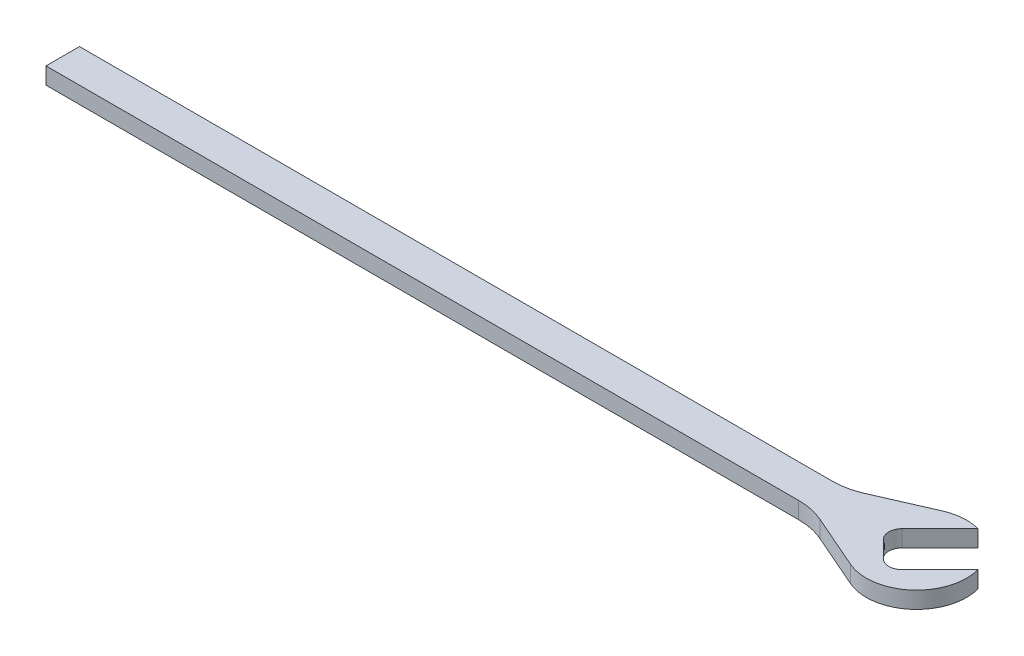
ISO-10303-21;
HEADER;
FILE_DESCRIPTION(('STEP AP214'),'2;1');
FILE_NAME('part.step','',(''),(''),'','','');
FILE_SCHEMA(('AUTOMOTIVE_DESIGN { 1 0 10303 214 1 1 1 1 }'));
ENDSEC;
DATA;
#1=APPLICATION_CONTEXT('core data for automotive mechanical design processes');
#2=APPLICATION_PROTOCOL_DEFINITION('international standard','automotive_design',2000,#1);
#3=PRODUCT_CONTEXT('',#1,'mechanical');
#4=PRODUCT('Part','Part','',(#3));
#5=PRODUCT_RELATED_PRODUCT_CATEGORY('part','',(#4));
#6=PRODUCT_DEFINITION_FORMATION('','',#4);
#7=PRODUCT_DEFINITION_CONTEXT('part definition',#1,'design');
#8=PRODUCT_DEFINITION('design','',#6,#7);
#9=PRODUCT_DEFINITION_SHAPE('','',#8);
#10=(LENGTH_UNIT() NAMED_UNIT(*) SI_UNIT(.MILLI.,.METRE.));
#11=(NAMED_UNIT(*) PLANE_ANGLE_UNIT() SI_UNIT($,.RADIAN.));
#12=(NAMED_UNIT(*) SI_UNIT($,.STERADIAN.) SOLID_ANGLE_UNIT());
#13=UNCERTAINTY_MEASURE_WITH_UNIT(LENGTH_MEASURE(1.E-05),#10,'distance_accuracy_value','');
#14=(GEOMETRIC_REPRESENTATION_CONTEXT(3) GLOBAL_UNCERTAINTY_ASSIGNED_CONTEXT((#13)) GLOBAL_UNIT_ASSIGNED_CONTEXT((#10,
#11,#12)) REPRESENTATION_CONTEXT('',''));
#15=CARTESIAN_POINT('',(0.,0.,0.));
#16=DIRECTION('',(0.,0.,1.));
#17=DIRECTION('',(1.,0.,0.));
#18=AXIS2_PLACEMENT_3D('',#15,#16,#17);
#19=CARTESIAN_POINT('',(-100.340463977486,3.175,-2.58626340515598));
#20=DIRECTION('',(0.,0.,1.));
#21=DIRECTION('',(1.,0.,0.));
#22=AXIS2_PLACEMENT_3D('',#19,#20,#21);
#23=PLANE('',#22);
#24=DIRECTION('',(-1.,0.,0.));
#25=VECTOR('',#24,1.);
#26=CARTESIAN_POINT('',(-100.340463977486,0.,-2.58626340515598));
#27=LINE('',#26,#25);
#28=CARTESIAN_POINT('',(39.3595360225142,0.,-2.58626340515598));
#29=VERTEX_POINT('',#28);
#30=CARTESIAN_POINT('',(-103.395029965112,0.,-2.58626340515598));
#31=VERTEX_POINT('',#30);
#32=EDGE_CURVE('E112',#29,#31,#27,.T.);
#33=ORIENTED_EDGE('',*,*,#32,.T.);
#34=DIRECTION('',(0.,-1.,0.));
#35=VECTOR('',#34,1.);
#36=CARTESIAN_POINT('',(-103.395029965112,3.175,-2.58626340515598));
#37=LINE('',#36,#35);
#38=CARTESIAN_POINT('',(-103.395029965112,3.175,-2.58626340515598));
#39=VERTEX_POINT('',#38);
#40=EDGE_CURVE('E11',#39,#31,#37,.T.);
#41=ORIENTED_EDGE('',*,*,#40,.F.);
#42=DIRECTION('',(-1.,0.,0.));
#43=VECTOR('',#42,1.);
#44=CARTESIAN_POINT('',(39.3595360225142,3.175,-2.58626340515598));
#45=LINE('',#44,#43);
#46=CARTESIAN_POINT('',(39.3595360225142,3.175,-2.58626340515598));
#47=VERTEX_POINT('',#46);
#48=EDGE_CURVE('E118',#47,#39,#45,.T.);
#49=ORIENTED_EDGE('',*,*,#48,.F.);
#50=DIRECTION('',(0.,-1.,0.));
#51=VECTOR('',#50,1.);
#52=CARTESIAN_POINT('',(39.3595360225142,3.175,-2.58626340515598));
#53=LINE('',#52,#51);
#54=EDGE_CURVE('E169',#47,#29,#53,.T.);
#55=ORIENTED_EDGE('',*,*,#54,.T.);
#56=EDGE_LOOP('',(#33,#41,#49,#55));
#57=FACE_BOUND('',#56,.T.);
#58=ADVANCED_FACE('F39',(#57),#23,.F.);
#59=CARTESIAN_POINT('',(-103.395029965112,3.175,-2.58626340515598));
#60=DIRECTION('',(1.,0.,0.));
#61=DIRECTION('',(0.,0.,-1.));
#62=AXIS2_PLACEMENT_3D('',#59,#60,#61);
#63=PLANE('',#62);
#64=DIRECTION('',(0.,0.,1.));
#65=VECTOR('',#64,1.);
#66=CARTESIAN_POINT('',(-103.395029965112,0.,-2.58626340515598));
#67=LINE('',#66,#65);
#68=CARTESIAN_POINT('',(-103.395029965112,0.,3.76373660422229));
#69=VERTEX_POINT('',#68);
#70=EDGE_CURVE('E217',#31,#69,#67,.T.);
#71=ORIENTED_EDGE('',*,*,#70,.T.);
#72=DIRECTION('',(0.,-1.,0.));
#73=VECTOR('',#72,1.);
#74=CARTESIAN_POINT('',(-103.395029965112,3.175,3.76373660422229));
#75=LINE('',#74,#73);
#76=CARTESIAN_POINT('',(-103.395029965112,3.175,3.76373660422229));
#77=VERTEX_POINT('',#76);
#78=EDGE_CURVE('E48',#77,#69,#75,.T.);
#79=ORIENTED_EDGE('',*,*,#78,.F.);
#80=DIRECTION('',(0.,0.,1.));
#81=VECTOR('',#80,1.);
#82=CARTESIAN_POINT('',(-103.395029965112,3.175,-2.58626340515598));
#83=LINE('',#82,#81);
#84=EDGE_CURVE('E186',#39,#77,#83,.T.);
#85=ORIENTED_EDGE('',*,*,#84,.F.);
#86=ORIENTED_EDGE('',*,*,#40,.T.);
#87=EDGE_LOOP('',(#71,#79,#85,#86));
#88=FACE_BOUND('',#87,.T.);
#89=ADVANCED_FACE('F431',(#88),#63,.F.);
#90=CARTESIAN_POINT('',(-103.395029965112,3.175,3.76373660422229));
#91=DIRECTION('',(0.,0.,-1.));
#92=DIRECTION('',(-1.,0.,0.));
#93=AXIS2_PLACEMENT_3D('',#90,#91,#92);
#94=PLANE('',#93);
#95=DIRECTION('',(1.,0.,0.));
#96=VECTOR('',#95,1.);
#97=CARTESIAN_POINT('',(-103.395029965112,0.,3.76373660422229));
#98=LINE('',#97,#96);
#99=CARTESIAN_POINT('',(39.3595360198875,0.,3.76373660422229));
#100=VERTEX_POINT('',#99);
#101=EDGE_CURVE('E222',#69,#100,#98,.T.);
#102=ORIENTED_EDGE('',*,*,#101,.T.);
#103=DIRECTION('',(0.,-1.,0.));
#104=VECTOR('',#103,1.);
#105=CARTESIAN_POINT('',(39.3595360198875,3.175,3.76373660422229));
#106=LINE('',#105,#104);
#107=CARTESIAN_POINT('',(39.3595360198875,3.175,3.76373660422229));
#108=VERTEX_POINT('',#107);
#109=EDGE_CURVE('E228',#108,#100,#106,.T.);
#110=ORIENTED_EDGE('',*,*,#109,.F.);
#111=DIRECTION('',(1.,0.,0.));
#112=VECTOR('',#111,1.);
#113=CARTESIAN_POINT('',(-103.395029965112,3.175,3.76373660422229));
#114=LINE('',#113,#112);
#115=EDGE_CURVE('E391',#77,#108,#114,.T.);
#116=ORIENTED_EDGE('',*,*,#115,.F.);
#117=ORIENTED_EDGE('',*,*,#78,.T.);
#118=EDGE_LOOP('',(#102,#110,#116,#117));
#119=FACE_BOUND('',#118,.T.);
#120=ADVANCED_FACE('F402',(#119),#94,.F.);
#121=CARTESIAN_POINT('',(39.3595360198875,3.175,3.76373660422229));
#122=CARTESIAN_POINT('',(40.6724989963621,3.175,3.76373660422229));
#123=CARTESIAN_POINT('',(41.9582312823623,3.175,4.03245417107038));
#124=CARTESIAN_POINT('',(43.2434309573625,3.175,4.30106042241869));
#125=CARTESIAN_POINT('',(44.4469556680005,3.175,4.82723535496382));
#126=B_SPLINE_CURVE_WITH_KNOTS('',2,(#121,#122,#123,#124,#125),.UNSPECIFIED.,.F.,.F.,(3,2,3),
(0.,0.5,1.),.UNSPECIFIED.);
#127=DIRECTION('',(0.,-1.,0.));
#128=VECTOR('',#127,1.);
#129=SURFACE_OF_LINEAR_EXTRUSION('',#126,#128);
#130=CARTESIAN_POINT('',(39.3595360198875,0.,3.76373660422229));
#131=CARTESIAN_POINT('',(40.6724989963621,0.,3.76373660422229));
#132=CARTESIAN_POINT('',(41.9582312823623,0.,4.03245417107038));
#133=CARTESIAN_POINT('',(43.2434309573625,0.,4.30106042241869));
#134=CARTESIAN_POINT('',(44.4469556680005,0.,4.82723535496382));
#135=B_SPLINE_CURVE_WITH_KNOTS('',2,(#130,#131,#132,#133,#134),.UNSPECIFIED.,.F.,.F.,(3,2,3),
(0.,0.5,1.),.UNSPECIFIED.);
#136=CARTESIAN_POINT('',(44.4469556680005,0.,4.82723535496382));
#137=VERTEX_POINT('',#136);
#138=EDGE_CURVE('E361',#100,#137,#135,.T.);
#139=ORIENTED_EDGE('',*,*,#138,.T.);
#140=DIRECTION('',(0.,-1.,0.));
#141=VECTOR('',#140,1.);
#142=CARTESIAN_POINT('',(44.4469556680005,3.175,4.82723535496382));
#143=LINE('',#142,#141);
#144=CARTESIAN_POINT('',(44.4469556680005,3.175,4.82723535496382));
#145=VERTEX_POINT('',#144);
#146=EDGE_CURVE('E436',#145,#137,#143,.T.);
#147=ORIENTED_EDGE('',*,*,#146,.F.);
#148=CARTESIAN_POINT('',(44.4469556680005,3.175,4.82723535496382));
#149=CARTESIAN_POINT('',(43.2434309573625,3.175,4.30106042241869));
#150=CARTESIAN_POINT('',(41.9582312823623,3.175,4.03245417107038));
#151=CARTESIAN_POINT('',(40.6724989963621,3.175,3.76373660422229));
#152=CARTESIAN_POINT('',(39.3595360198875,3.175,3.76373660422229));
#153=B_SPLINE_CURVE_WITH_KNOTS('',2,(#148,#149,#150,#151,#152),.UNSPECIFIED.,.F.,.F.,(3,2,3),
(0.,0.5,1.),.UNSPECIFIED.);
#154=EDGE_CURVE('E375',#108,#145,#153,.F.);
#155=ORIENTED_EDGE('',*,*,#154,.F.);
#156=ORIENTED_EDGE('',*,*,#109,.T.);
#157=EDGE_LOOP('',(#139,#147,#155,#156));
#158=FACE_BOUND('',#157,.T.);
#159=ADVANCED_FACE('F393',(#158),#129,.F.);
#160=CARTESIAN_POINT('',(44.4469556680005,3.175,4.82723535496382));
#161=DIRECTION('',(0.400584223186302,0.,-0.916259941356287));
#162=DIRECTION('',(-0.916259941356287,0.,-0.400584223186302));
#163=AXIS2_PLACEMENT_3D('',#160,#161,#162);
#164=PLANE('',#163);
#165=DIRECTION('',(0.916259941356287,0.,0.400584223186302));
#166=VECTOR('',#165,1.);
#167=CARTESIAN_POINT('',(44.4469556680005,0.,4.82723535496382));
#168=LINE('',#167,#166);
#169=CARTESIAN_POINT('',(54.7144053040725,0.,9.31611252936279));
#170=VERTEX_POINT('',#169);
#171=EDGE_CURVE('E358',#137,#170,#168,.T.);
#172=ORIENTED_EDGE('',*,*,#171,.T.);
#173=DIRECTION('',(0.,-1.,0.));
#174=VECTOR('',#173,1.);
#175=CARTESIAN_POINT('',(54.7144053040725,3.175,9.31611252936279));
#176=LINE('',#175,#174);
#177=CARTESIAN_POINT('',(54.7144053040725,3.175,9.31611252936279));
#178=VERTEX_POINT('',#177);
#179=EDGE_CURVE('E438',#178,#170,#176,.T.);
#180=ORIENTED_EDGE('',*,*,#179,.F.);
#181=DIRECTION('',(0.916259941356287,0.,0.400584223186302));
#182=VECTOR('',#181,1.);
#183=CARTESIAN_POINT('',(44.4469556680005,3.175,4.82723535496382));
#184=LINE('',#183,#182);
#185=EDGE_CURVE('E275',#145,#178,#184,.T.);
#186=ORIENTED_EDGE('',*,*,#185,.F.);
#187=ORIENTED_EDGE('',*,*,#146,.T.);
#188=EDGE_LOOP('',(#172,#180,#186,#187));
#189=FACE_BOUND('',#188,.T.);
#190=ADVANCED_FACE('F289',(#189),#164,.F.);
#191=CARTESIAN_POINT('',(54.7144053040725,3.175,9.31611252936279));
#192=CARTESIAN_POINT('',(55.946669165121,3.175,9.85485207348279));
#193=CARTESIAN_POINT('',(57.280466920045,3.175,10.0314251371246));
#194=CARTESIAN_POINT('',(58.613452189834,3.175,10.207890640989));
#195=CARTESIAN_POINT('',(59.944261722186,3.175,10.0081529245056));
#196=CARTESIAN_POINT('',(61.2739834384635,3.175,9.80857847548711));
#197=CARTESIAN_POINT('',(62.4974339656085,3.175,9.24811618907208));
#198=CARTESIAN_POINT('',(63.7198844329125,3.175,8.68811202974293));
#199=CARTESIAN_POINT('',(64.7402805409845,3.175,7.81076321115883));
#200=CARTESIAN_POINT('',(65.759842567798,3.175,6.93413154564941));
#201=CARTESIAN_POINT('',(66.4973712806065,3.175,5.80852034963424));
#202=CARTESIAN_POINT('',(67.2342971306005,3.175,4.68382923865635));
#203=CARTESIAN_POINT('',(67.631270692224,3.175,3.39799831735065));
#204=CARTESIAN_POINT('',(68.0279197639925,3.175,2.11321844611236));
#205=CARTESIAN_POINT('',(68.053287839004,3.175,0.767742460667672));
#206=CARTESIAN_POINT('',(68.078640466437,3.175,-0.57691421366278));
#207=CARTESIAN_POINT('',(67.730413535366,3.175,-1.87651481271589));
#208=B_SPLINE_CURVE_WITH_KNOTS('',2,(#191,#192,#193,#194,#195,#196,#197,#198,#199,#200,#201,
#202,#203,#204,#205,#206,#207),.UNSPECIFIED.,.F.,.F.,(3,2,2,2,2,2,2,2,3),(0.,0.125,0.25,0.375,
0.5,0.625,0.75,0.875,1.),.UNSPECIFIED.);
#209=DIRECTION('',(0.,-1.,0.));
#210=VECTOR('',#209,1.);
#211=SURFACE_OF_LINEAR_EXTRUSION('',#208,#210);
#212=CARTESIAN_POINT('',(54.7144053040725,0.,9.31611252936279));
#213=CARTESIAN_POINT('',(55.946669165121,0.,9.85485207348279));
#214=CARTESIAN_POINT('',(57.280466920045,0.,10.0314251371246));
#215=CARTESIAN_POINT('',(58.613452189834,0.,10.207890640989));
#216=CARTESIAN_POINT('',(59.944261722186,0.,10.0081529245056));
#217=CARTESIAN_POINT('',(61.2739834384635,0.,9.80857847548711));
#218=CARTESIAN_POINT('',(62.4974339656085,0.,9.24811618907208));
#219=CARTESIAN_POINT('',(63.7198844329125,0.,8.68811202974293));
#220=CARTESIAN_POINT('',(64.7402805409845,0.,7.81076321115883));
#221=CARTESIAN_POINT('',(65.759842567798,0.,6.93413154564941));
#222=CARTESIAN_POINT('',(66.4973712806065,0.,5.80852034963424));
#223=CARTESIAN_POINT('',(67.2342971306005,0.,4.68382923865635));
#224=CARTESIAN_POINT('',(67.631270692224,0.,3.39799831735065));
#225=CARTESIAN_POINT('',(68.0279197639925,0.,2.11321844611236));
#226=CARTESIAN_POINT('',(68.053287839004,0.,0.767742460667672));
#227=CARTESIAN_POINT('',(68.078640466437,0.,-0.57691421366278));
#228=CARTESIAN_POINT('',(67.730413535366,0.,-1.87651481271589));
#229=B_SPLINE_CURVE_WITH_KNOTS('',2,(#212,#213,#214,#215,#216,#217,#218,#219,#220,#221,#222,
#223,#224,#225,#226,#227,#228),.UNSPECIFIED.,.F.,.F.,(3,2,2,2,2,2,2,2,3),(0.,0.125,0.25,0.375,
0.5,0.625,0.75,0.875,1.),.UNSPECIFIED.);
#230=CARTESIAN_POINT('',(67.730413535366,0.,-1.87651481271589));
#231=VERTEX_POINT('',#230);
#232=EDGE_CURVE('E351',#170,#231,#229,.T.);
#233=ORIENTED_EDGE('',*,*,#232,.T.);
#234=DIRECTION('',(0.,-1.,0.));
#235=VECTOR('',#234,1.);
#236=CARTESIAN_POINT('',(67.730413535366,3.175,-1.87651481271589));
#237=LINE('',#236,#235);
#238=CARTESIAN_POINT('',(67.730413535366,3.175,-1.87651481271589));
#239=VERTEX_POINT('',#238);
#240=EDGE_CURVE('E445',#239,#231,#237,.T.);
#241=ORIENTED_EDGE('',*,*,#240,.F.);
#242=CARTESIAN_POINT('',(67.730413535366,3.175,-1.87651481271589));
#243=CARTESIAN_POINT('',(68.078640466437,3.175,-0.57691421366278));
#244=CARTESIAN_POINT('',(68.053287839004,3.175,0.767742460667672));
#245=CARTESIAN_POINT('',(68.0279197639925,3.175,2.11321844611236));
#246=CARTESIAN_POINT('',(67.631270692224,3.175,3.39799831735065));
#247=CARTESIAN_POINT('',(67.2342971306005,3.175,4.68382923865635));
#248=CARTESIAN_POINT('',(66.4973712806065,3.175,5.80852034963424));
#249=CARTESIAN_POINT('',(65.759842567798,3.175,6.93413154564941));
#250=CARTESIAN_POINT('',(64.7402805409845,3.175,7.81076321115883));
#251=CARTESIAN_POINT('',(63.7198844329125,3.175,8.68811202974293));
#252=CARTESIAN_POINT('',(62.4974339656085,3.175,9.24811618907208));
#253=CARTESIAN_POINT('',(61.2739834384635,3.175,9.80857847548711));
#254=CARTESIAN_POINT('',(59.944261722186,3.175,10.0081529245056));
#255=CARTESIAN_POINT('',(58.613452189834,3.175,10.207890640989));
#256=CARTESIAN_POINT('',(57.280466920045,3.175,10.0314251371246));
#257=CARTESIAN_POINT('',(55.946669165121,3.175,9.85485207348279));
#258=CARTESIAN_POINT('',(54.7144053040725,3.175,9.31611252936279));
#259=B_SPLINE_CURVE_WITH_KNOTS('',2,(#242,#243,#244,#245,#246,#247,#248,#249,#250,#251,#252,
#253,#254,#255,#256,#257,#258),.UNSPECIFIED.,.F.,.F.,(3,2,2,2,2,2,2,2,3),(0.,0.125,0.25,0.375,
0.5,0.625,0.75,0.875,1.),.UNSPECIFIED.);
#260=EDGE_CURVE('E270',#178,#239,#259,.F.);
#261=ORIENTED_EDGE('',*,*,#260,.F.);
#262=ORIENTED_EDGE('',*,*,#179,.T.);
#263=EDGE_LOOP('',(#233,#241,#261,#262));
#264=FACE_BOUND('',#263,.T.);
#265=ADVANCED_FACE('F277',(#264),#211,.F.);
#266=CARTESIAN_POINT('',(67.730413535366,3.175,-1.87651481271589));
#267=DIRECTION('',(0.707106781186548,0.,0.707106781186548));
#268=DIRECTION('',(0.707106781186548,0.,-0.707106781186548));
#269=AXIS2_PLACEMENT_3D('',#266,#267,#268);
#270=PLANE('',#269);
#271=DIRECTION('',(-0.707106781186548,0.,0.707106781186548));
#272=VECTOR('',#271,1.);
#273=CARTESIAN_POINT('',(67.730413535366,0.,-1.87651481271589));
#274=LINE('',#273,#272);
#275=CARTESIAN_POINT('',(60.5462086385134,0.,5.30769008413673));
#276=VERTEX_POINT('',#275);
#277=EDGE_CURVE('E345',#231,#276,#274,.T.);
#278=ORIENTED_EDGE('',*,*,#277,.T.);
#279=DIRECTION('',(0.,-1.,0.));
#280=VECTOR('',#279,1.);
#281=CARTESIAN_POINT('',(60.5462086385134,3.175,5.30769008413673));
#282=LINE('',#281,#280);
#283=CARTESIAN_POINT('',(60.5462086385134,3.175,5.30769008413673));
#284=VERTEX_POINT('',#283);
#285=EDGE_CURVE('E447',#284,#276,#282,.T.);
#286=ORIENTED_EDGE('',*,*,#285,.F.);
#287=DIRECTION('',(-0.707106781186548,0.,0.707106781186548));
#288=VECTOR('',#287,1.);
#289=CARTESIAN_POINT('',(67.730413535366,3.175,-1.87651481271589));
#290=LINE('',#289,#288);
#291=EDGE_CURVE('E474',#239,#284,#290,.T.);
#292=ORIENTED_EDGE('',*,*,#291,.F.);
#293=ORIENTED_EDGE('',*,*,#240,.T.);
#294=EDGE_LOOP('',(#278,#286,#292,#293));
#295=FACE_BOUND('',#294,.T.);
#296=ADVANCED_FACE('F288',(#295),#270,.F.);
#297=CARTESIAN_POINT('',(60.5462086385134,3.175,5.30769008413673));
#298=CARTESIAN_POINT('',(60.1891540915159,3.175,5.66474463113412));
#299=CARTESIAN_POINT('',(59.7221733326049,3.175,5.85829287243601));
#300=CARTESIAN_POINT('',(59.2559448038874,3.175,6.05152933894151));
#301=CARTESIAN_POINT('',(58.7501574145134,3.175,6.05163885983434));
#302=CARTESIAN_POINT('',(58.2454700250914,3.175,6.05174814253819));
#303=CARTESIAN_POINT('',(57.7781414964219,3.175,5.85829287243603));
#304=CARTESIAN_POINT('',(57.3115650339624,3.175,5.66514892758559));
#305=CARTESIAN_POINT('',(56.9541061905134,3.175,5.30769008413673));
#306=B_SPLINE_CURVE_WITH_KNOTS('',2,(#297,#298,#299,#300,#301,#302,#303,#304,#305),
.UNSPECIFIED.,.F.,.F.,(3,2,2,2,3),(0.,0.25,0.5,0.75,1.),.UNSPECIFIED.);
#307=DIRECTION('',(0.,-1.,0.));
#308=VECTOR('',#307,1.);
#309=SURFACE_OF_LINEAR_EXTRUSION('',#306,#308);
#310=CARTESIAN_POINT('',(60.5462086385134,0.,5.30769008413673));
#311=CARTESIAN_POINT('',(60.1891540915159,0.,5.66474463113412));
#312=CARTESIAN_POINT('',(59.7221733326049,0.,5.85829287243601));
#313=CARTESIAN_POINT('',(59.2559448038874,0.,6.05152933894151));
#314=CARTESIAN_POINT('',(58.7501574145134,0.,6.05163885983434));
#315=CARTESIAN_POINT('',(58.2454700250914,0.,6.05174814253819));
#316=CARTESIAN_POINT('',(57.7781414964219,0.,5.85829287243603));
#317=CARTESIAN_POINT('',(57.3115650339624,0.,5.66514892758559));
#318=CARTESIAN_POINT('',(56.9541061905134,0.,5.30769008413673));
#319=B_SPLINE_CURVE_WITH_KNOTS('',2,(#310,#311,#312,#313,#314,#315,#316,#317,#318),
.UNSPECIFIED.,.F.,.F.,(3,2,2,2,3),(0.,0.25,0.5,0.75,1.),.UNSPECIFIED.);
#320=CARTESIAN_POINT('',(56.9541061905134,0.,5.30769008413673));
#321=VERTEX_POINT('',#320);
#322=EDGE_CURVE('E341',#276,#321,#319,.T.);
#323=ORIENTED_EDGE('',*,*,#322,.T.);
#324=DIRECTION('',(0.,-1.,0.));
#325=VECTOR('',#324,1.);
#326=CARTESIAN_POINT('',(56.9541061905134,3.175,5.30769008413673));
#327=LINE('',#326,#325);
#328=CARTESIAN_POINT('',(56.9541061905134,3.175,5.30769008413673));
#329=VERTEX_POINT('',#328);
#330=EDGE_CURVE('E463',#329,#321,#327,.T.);
#331=ORIENTED_EDGE('',*,*,#330,.F.);
#332=CARTESIAN_POINT('',(56.9541061905134,3.175,5.30769008413673));
#333=CARTESIAN_POINT('',(57.3115650339624,3.175,5.66514892758559));
#334=CARTESIAN_POINT('',(57.7781414964219,3.175,5.85829287243603));
#335=CARTESIAN_POINT('',(58.2454700250914,3.175,6.05174814253819));
#336=CARTESIAN_POINT('',(58.7501574145134,3.175,6.05163885983434));
#337=CARTESIAN_POINT('',(59.2559448038874,3.175,6.05152933894151));
#338=CARTESIAN_POINT('',(59.7221733326049,3.175,5.85829287243601));
#339=CARTESIAN_POINT('',(60.1891540915159,3.175,5.66474463113412));
#340=CARTESIAN_POINT('',(60.5462086385134,3.175,5.30769008413673));
#341=B_SPLINE_CURVE_WITH_KNOTS('',2,(#332,#333,#334,#335,#336,#337,#338,#339,#340),
.UNSPECIFIED.,.F.,.F.,(3,2,2,2,3),(0.,0.25,0.5,0.75,1.),.UNSPECIFIED.);
#342=EDGE_CURVE('E475',#284,#329,#341,.F.);
#343=ORIENTED_EDGE('',*,*,#342,.F.);
#344=ORIENTED_EDGE('',*,*,#285,.T.);
#345=EDGE_LOOP('',(#323,#331,#343,#344));
#346=FACE_BOUND('',#345,.T.);
#347=ADVANCED_FACE('F314',(#346),#309,.F.);
#348=CARTESIAN_POINT('',(56.9541061905134,3.175,5.30769008413673));
#349=DIRECTION('',(-0.707106781186549,0.,0.707106781186546));
#350=DIRECTION('',(0.707106781186546,0.,0.707106781186549));
#351=AXIS2_PLACEMENT_3D('',#348,#349,#350);
#352=PLANE('',#351);
#353=DIRECTION('',(-0.707106781186546,0.,-0.707106781186549));
#354=VECTOR('',#353,1.);
#355=CARTESIAN_POINT('',(56.9541061905134,0.,5.30769008413673));
#356=LINE('',#355,#354);
#357=CARTESIAN_POINT('',(53.8110165485135,0.,2.16460044213683));
#358=VERTEX_POINT('',#357);
#359=EDGE_CURVE('E357',#321,#358,#356,.T.);
#360=ORIENTED_EDGE('',*,*,#359,.T.);
#361=DIRECTION('',(0.,-1.,0.));
#362=VECTOR('',#361,1.);
#363=CARTESIAN_POINT('',(53.8110165485135,3.175,2.16460044213683));
#364=LINE('',#363,#362);
#365=CARTESIAN_POINT('',(53.8110165485135,3.175,2.16460044213683));
#366=VERTEX_POINT('',#365);
#367=EDGE_CURVE('E467',#366,#358,#364,.T.);
#368=ORIENTED_EDGE('',*,*,#367,.F.);
#369=DIRECTION('',(-0.707106781186546,0.,-0.707106781186549));
#370=VECTOR('',#369,1.);
#371=CARTESIAN_POINT('',(56.9541061905134,3.175,5.30769008413673));
#372=LINE('',#371,#370);
#373=EDGE_CURVE('E476',#329,#366,#372,.T.);
#374=ORIENTED_EDGE('',*,*,#373,.F.);
#375=ORIENTED_EDGE('',*,*,#330,.T.);
#376=EDGE_LOOP('',(#360,#368,#374,#375));
#377=FACE_BOUND('',#376,.T.);
#378=ADVANCED_FACE('F318',(#377),#352,.F.);
#379=CARTESIAN_POINT('',(53.8110165485135,3.175,2.16460044213683));
#380=CARTESIAN_POINT('',(53.453962001521,3.175,1.80754589514406));
#381=CARTESIAN_POINT('',(53.2604137602145,3.175,1.34056513622843));
#382=CARTESIAN_POINT('',(53.067177293707,3.175,0.874336607513709));
#383=CARTESIAN_POINT('',(53.067067772816,3.175,0.368549218136838));
#384=CARTESIAN_POINT('',(53.0669584901135,3.175,-0.136138171284508));
#385=CARTESIAN_POINT('',(53.2604137602145,3.175,-0.603466699954772));
#386=CARTESIAN_POINT('',(53.4535577050615,3.175,-1.07004316241126));
#387=CARTESIAN_POINT('',(53.8110165485135,3.175,-1.42750200586317));
#388=B_SPLINE_CURVE_WITH_KNOTS('',2,(#379,#380,#381,#382,#383,#384,#385,#386,#387),
.UNSPECIFIED.,.F.,.F.,(3,2,2,2,3),(0.,0.25,0.5,0.75,1.),.UNSPECIFIED.);
#389=DIRECTION('',(0.,-1.,0.));
#390=VECTOR('',#389,1.);
#391=SURFACE_OF_LINEAR_EXTRUSION('',#388,#390);
#392=CARTESIAN_POINT('',(53.8110165485135,0.,2.16460044213683));
#393=CARTESIAN_POINT('',(53.453962001521,0.,1.80754589514406));
#394=CARTESIAN_POINT('',(53.2604137602145,0.,1.34056513622843));
#395=CARTESIAN_POINT('',(53.067177293707,0.,0.874336607513709));
#396=CARTESIAN_POINT('',(53.067067772816,0.,0.368549218136838));
#397=CARTESIAN_POINT('',(53.0669584901135,0.,-0.136138171284508));
#398=CARTESIAN_POINT('',(53.2604137602145,0.,-0.603466699954772));
#399=CARTESIAN_POINT('',(53.4535577050615,0.,-1.07004316241126));
#400=CARTESIAN_POINT('',(53.8110165485135,0.,-1.42750200586317));
#401=B_SPLINE_CURVE_WITH_KNOTS('',2,(#392,#393,#394,#395,#396,#397,#398,#399,#400),
.UNSPECIFIED.,.F.,.F.,(3,2,2,2,3),(0.,0.25,0.5,0.75,1.),.UNSPECIFIED.);
#402=CARTESIAN_POINT('',(53.8110165485135,0.,-1.42750200586317));
#403=VERTEX_POINT('',#402);
#404=EDGE_CURVE('E604',#358,#403,#401,.T.);
#405=ORIENTED_EDGE('',*,*,#404,.T.);
#406=DIRECTION('',(0.,-1.,0.));
#407=VECTOR('',#406,1.);
#408=CARTESIAN_POINT('',(53.8110165485135,3.175,-1.42750200586317));
#409=LINE('',#408,#407);
#410=CARTESIAN_POINT('',(53.8110165485135,3.175,-1.42750200586317));
#411=VERTEX_POINT('',#410);
#412=EDGE_CURVE('E226',#411,#403,#409,.T.);
#413=ORIENTED_EDGE('',*,*,#412,.F.);
#414=CARTESIAN_POINT('',(53.8110165485135,3.175,-1.42750200586317));
#415=CARTESIAN_POINT('',(53.4535577050615,3.175,-1.07004316241126));
#416=CARTESIAN_POINT('',(53.2604137602145,3.175,-0.603466699954772));
#417=CARTESIAN_POINT('',(53.0669584901135,3.175,-0.136138171284508));
#418=CARTESIAN_POINT('',(53.067067772816,3.175,0.368549218136838));
#419=CARTESIAN_POINT('',(53.067177293707,3.175,0.874336607513709));
#420=CARTESIAN_POINT('',(53.2604137602145,3.175,1.34056513622843));
#421=CARTESIAN_POINT('',(53.453962001521,3.175,1.80754589514406));
#422=CARTESIAN_POINT('',(53.8110165485135,3.175,2.16460044213683));
#423=B_SPLINE_CURVE_WITH_KNOTS('',2,(#414,#415,#416,#417,#418,#419,#420,#421,#422),
.UNSPECIFIED.,.F.,.F.,(3,2,2,2,3),(0.,0.25,0.5,0.75,1.),.UNSPECIFIED.);
#424=EDGE_CURVE('E624',#366,#411,#423,.F.);
#425=ORIENTED_EDGE('',*,*,#424,.F.);
#426=ORIENTED_EDGE('',*,*,#367,.T.);
#427=EDGE_LOOP('',(#405,#413,#425,#426));
#428=FACE_BOUND('',#427,.T.);
#429=ADVANCED_FACE('F527',(#428),#391,.F.);
#430=CARTESIAN_POINT('',(53.8110165485135,3.175,-1.42750200586317));
#431=DIRECTION('',(-0.707106781186548,0.,-0.707106781186548));
#432=DIRECTION('',(-0.707106781186548,0.,0.707106781186548));
#433=AXIS2_PLACEMENT_3D('',#430,#431,#432);
#434=PLANE('',#433);
#435=DIRECTION('',(0.707106781186548,0.,-0.707106781186548));
#436=VECTOR('',#435,1.);
#437=CARTESIAN_POINT('',(53.8110165485135,0.,-1.42750200586317));
#438=LINE('',#437,#436);
#439=CARTESIAN_POINT('',(60.995221445572,0.,-8.61170690292162));
#440=VERTEX_POINT('',#439);
#441=EDGE_CURVE('E223',#403,#440,#438,.T.);
#442=ORIENTED_EDGE('',*,*,#441,.T.);
#443=DIRECTION('',(0.,-1.,0.));
#444=VECTOR('',#443,1.);
#445=CARTESIAN_POINT('',(60.995221445572,3.175,-8.61170690292162));
#446=LINE('',#445,#444);
#447=CARTESIAN_POINT('',(60.995221445572,3.175,-8.61170690292162));
#448=VERTEX_POINT('',#447);
#449=EDGE_CURVE('E164',#448,#440,#446,.T.);
#450=ORIENTED_EDGE('',*,*,#449,.F.);
#451=DIRECTION('',(0.707106781186548,0.,-0.707106781186548));
#452=VECTOR('',#451,1.);
#453=CARTESIAN_POINT('',(53.8110165485135,3.175,-1.42750200586317));
#454=LINE('',#453,#452);
#455=EDGE_CURVE('E156',#411,#448,#454,.T.);
#456=ORIENTED_EDGE('',*,*,#455,.F.);
#457=ORIENTED_EDGE('',*,*,#412,.T.);
#458=EDGE_LOOP('',(#442,#450,#456,#457));
#459=FACE_BOUND('',#458,.T.);
#460=ADVANCED_FACE('F536',(#459),#434,.F.);
#461=CARTESIAN_POINT('',(58.5299700334511,3.175,0.588736585831584));
#462=DIRECTION('',(0.,-1.,0.));
#463=DIRECTION('',(0.,0.,-1.));
#464=AXIS2_PLACEMENT_3D('',#461,#462,#463);
#465=CYLINDRICAL_SURFACE('',#464,9.52499999549699);
#466=CARTESIAN_POINT('',(58.5299700334511,0.,0.588736585831584));
#467=DIRECTION('',(0.,1.,0.));
#468=DIRECTION('',(0.,0.,1.));
#469=AXIS2_PLACEMENT_3D('',#466,#467,#468);
#470=CIRCLE('',#469,9.52499999549699);
#471=CARTESIAN_POINT('',(54.7144052951649,0.,-8.13863934523525));
#472=VERTEX_POINT('',#471);
#473=EDGE_CURVE('E163',#440,#472,#470,.T.);
#474=ORIENTED_EDGE('',*,*,#473,.T.);
#475=DIRECTION('',(0.,-1.,0.));
#476=VECTOR('',#475,1.);
#477=CARTESIAN_POINT('',(54.7144052951649,3.175,-8.13863934523525));
#478=LINE('',#477,#476);
#479=CARTESIAN_POINT('',(54.7144052951649,3.175,-8.13863934523525));
#480=VERTEX_POINT('',#479);
#481=EDGE_CURVE('E161',#480,#472,#478,.T.);
#482=ORIENTED_EDGE('',*,*,#481,.F.);
#483=CARTESIAN_POINT('',(58.5299700334516,3.175,0.588736586578889));
#484=DIRECTION('',(0.,1.,0.));
#485=DIRECTION('',(0.,0.,1.));
#486=AXIS2_PLACEMENT_3D('',#483,#484,#485);
#487=CIRCLE('',#486,9.5249999962443);
#488=EDGE_CURVE('E150',#448,#480,#487,.T.);
#489=ORIENTED_EDGE('',*,*,#488,.F.);
#490=ORIENTED_EDGE('',*,*,#449,.T.);
#491=EDGE_LOOP('',(#474,#482,#489,#490));
#492=FACE_BOUND('',#491,.T.);
#493=ADVANCED_FACE('F162',(#492),#465,.T.);
#494=CARTESIAN_POINT('',(54.7144052951649,3.175,-8.13863934523525));
#495=DIRECTION('',(0.40058422468137,0.,0.916259940702651));
#496=DIRECTION('',(0.916259940702651,0.,-0.40058422468137));
#497=AXIS2_PLACEMENT_3D('',#494,#495,#496);
#498=PLANE('',#497);
#499=DIRECTION('',(-0.916259940702651,0.,0.40058422468137));
#500=VECTOR('',#499,1.);
#501=CARTESIAN_POINT('',(54.7144052951649,0.,-8.13863934523525));
#502=LINE('',#501,#500);
#503=CARTESIAN_POINT('',(44.4469556705142,0.,-3.6497621558739));
#504=VERTEX_POINT('',#503);
#505=EDGE_CURVE('E105',#472,#504,#502,.T.);
#506=ORIENTED_EDGE('',*,*,#505,.T.);
#507=DIRECTION('',(0.,-1.,0.));
#508=VECTOR('',#507,1.);
#509=CARTESIAN_POINT('',(44.4469556705142,3.175,-3.6497621558739));
#510=LINE('',#509,#508);
#511=CARTESIAN_POINT('',(44.4469556705142,3.175,-3.6497621558739));
#512=VERTEX_POINT('',#511);
#513=EDGE_CURVE('E165',#512,#504,#510,.T.);
#514=ORIENTED_EDGE('',*,*,#513,.F.);
#515=DIRECTION('',(-0.916259940702651,0.,0.40058422468137));
#516=VECTOR('',#515,1.);
#517=CARTESIAN_POINT('',(54.7144052951649,3.175,-8.13863934523525));
#518=LINE('',#517,#516);
#519=EDGE_CURVE('E154',#480,#512,#518,.T.);
#520=ORIENTED_EDGE('',*,*,#519,.F.);
#521=ORIENTED_EDGE('',*,*,#481,.T.);
#522=EDGE_LOOP('',(#506,#514,#520,#521));
#523=FACE_BOUND('',#522,.T.);
#524=ADVANCED_FACE('F167',(#523),#498,.F.);
#525=CARTESIAN_POINT('',(44.4469556705142,3.175,-3.6497621558739));
#526=CARTESIAN_POINT('',(43.2439402913252,3.175,-3.12380990046911));
#527=CARTESIAN_POINT('',(41.9582312849312,3.175,-2.8549809719981));
#528=CARTESIAN_POINT('',(40.6730548798836,3.175,-2.58626340515598));
#529=CARTESIAN_POINT('',(39.3595360225142,3.175,-2.58626340515598));
#530=B_SPLINE_CURVE_WITH_KNOTS('',2,(#525,#526,#527,#528,#529),.UNSPECIFIED.,.F.,.F.,(3,2,3),
(0.,0.5,1.),.UNSPECIFIED.);
#531=DIRECTION('',(0.,-1.,0.));
#532=VECTOR('',#531,1.);
#533=SURFACE_OF_LINEAR_EXTRUSION('',#530,#532);
#534=CARTESIAN_POINT('',(44.4469556705142,0.,-3.6497621558739));
#535=CARTESIAN_POINT('',(43.2439402913252,0.,-3.12380990046911));
#536=CARTESIAN_POINT('',(41.9582312849312,0.,-2.8549809719981));
#537=CARTESIAN_POINT('',(40.6730548798836,0.,-2.58626340515598));
#538=CARTESIAN_POINT('',(39.3595360225142,0.,-2.58626340515598));
#539=B_SPLINE_CURVE_WITH_KNOTS('',2,(#534,#535,#536,#537,#538),.UNSPECIFIED.,.F.,.F.,(3,2,3),
(0.,0.5,1.),.UNSPECIFIED.);
#540=EDGE_CURVE('E187',#504,#29,#539,.T.);
#541=ORIENTED_EDGE('',*,*,#540,.T.);
#542=ORIENTED_EDGE('',*,*,#54,.F.);
#543=CARTESIAN_POINT('',(39.3595360225142,3.175,-2.58626340515598));
#544=CARTESIAN_POINT('',(40.6730548798836,3.175,-2.58626340515598));
#545=CARTESIAN_POINT('',(41.9582312849312,3.175,-2.8549809719981));
#546=CARTESIAN_POINT('',(43.2439402913252,3.175,-3.12380990046911));
#547=CARTESIAN_POINT('',(44.4469556705142,3.175,-3.6497621558739));
#548=B_SPLINE_CURVE_WITH_KNOTS('',2,(#543,#544,#545,#546,#547),.UNSPECIFIED.,.F.,.F.,(3,2,3),
(0.,0.5,1.),.UNSPECIFIED.);
#549=EDGE_CURVE('E57',#512,#47,#548,.F.);
#550=ORIENTED_EDGE('',*,*,#549,.F.);
#551=ORIENTED_EDGE('',*,*,#513,.T.);
#552=EDGE_LOOP('',(#541,#542,#550,#551));
#553=FACE_BOUND('',#552,.T.);
#554=ADVANCED_FACE('F196',(#553),#533,.F.);
#555=CARTESIAN_POINT('',(41.9582312823623,3.175,4.03245417107038));
#556=DIRECTION('',(0.,1.,0.));
#557=DIRECTION('',(0.,0.,1.));
#558=AXIS2_PLACEMENT_3D('',#555,#556,#557);
#559=PLANE('',#558);
#560=ORIENTED_EDGE('',*,*,#48,.T.);
#561=ORIENTED_EDGE('',*,*,#84,.T.);
#562=ORIENTED_EDGE('',*,*,#115,.T.);
#563=ORIENTED_EDGE('',*,*,#154,.T.);
#564=ORIENTED_EDGE('',*,*,#185,.T.);
#565=ORIENTED_EDGE('',*,*,#260,.T.);
#566=ORIENTED_EDGE('',*,*,#291,.T.);
#567=ORIENTED_EDGE('',*,*,#342,.T.);
#568=ORIENTED_EDGE('',*,*,#373,.T.);
#569=ORIENTED_EDGE('',*,*,#424,.T.);
#570=ORIENTED_EDGE('',*,*,#455,.T.);
#571=ORIENTED_EDGE('',*,*,#488,.T.);
#572=ORIENTED_EDGE('',*,*,#519,.T.);
#573=ORIENTED_EDGE('',*,*,#549,.T.);
#574=EDGE_LOOP('',(#560,#561,#562,#563,#564,#565,#566,#567,#568,#569,#570,#571,#572,#573));
#575=FACE_BOUND('',#574,.T.);
#576=ADVANCED_FACE('F152',(#575),#559,.T.);
#577=CARTESIAN_POINT('',(41.9582312823623,0.,4.03245417107038));
#578=DIRECTION('',(0.,1.,0.));
#579=DIRECTION('',(0.,0.,1.));
#580=AXIS2_PLACEMENT_3D('',#577,#578,#579);
#581=PLANE('',#580);
#582=ORIENTED_EDGE('',*,*,#32,.F.);
#583=ORIENTED_EDGE('',*,*,#540,.F.);
#584=ORIENTED_EDGE('',*,*,#505,.F.);
#585=ORIENTED_EDGE('',*,*,#473,.F.);
#586=ORIENTED_EDGE('',*,*,#441,.F.);
#587=ORIENTED_EDGE('',*,*,#404,.F.);
#588=ORIENTED_EDGE('',*,*,#359,.F.);
#589=ORIENTED_EDGE('',*,*,#322,.F.);
#590=ORIENTED_EDGE('',*,*,#277,.F.);
#591=ORIENTED_EDGE('',*,*,#232,.F.);
#592=ORIENTED_EDGE('',*,*,#171,.F.);
#593=ORIENTED_EDGE('',*,*,#138,.F.);
#594=ORIENTED_EDGE('',*,*,#101,.F.);
#595=ORIENTED_EDGE('',*,*,#70,.F.);
#596=EDGE_LOOP('',(#582,#583,#584,#585,#586,#587,#588,#589,#590,#591,#592,#593,#594,#595));
#597=FACE_BOUND('',#596,.T.);
#598=ADVANCED_FACE('F207',(#597),#581,.F.);
#599=CLOSED_SHELL('',(#58,#89,#120,#159,#190,#265,#296,#347,#378,#429,#460,#493,#524,#554,#576,#598));
#600=MANIFOLD_SOLID_BREP('B2',#599);
#601=ADVANCED_BREP_SHAPE_REPRESENTATION('',(#18,#600),#14);
#602=SHAPE_DEFINITION_REPRESENTATION(#9,#601);
ENDSEC;
END-ISO-10303-21;
